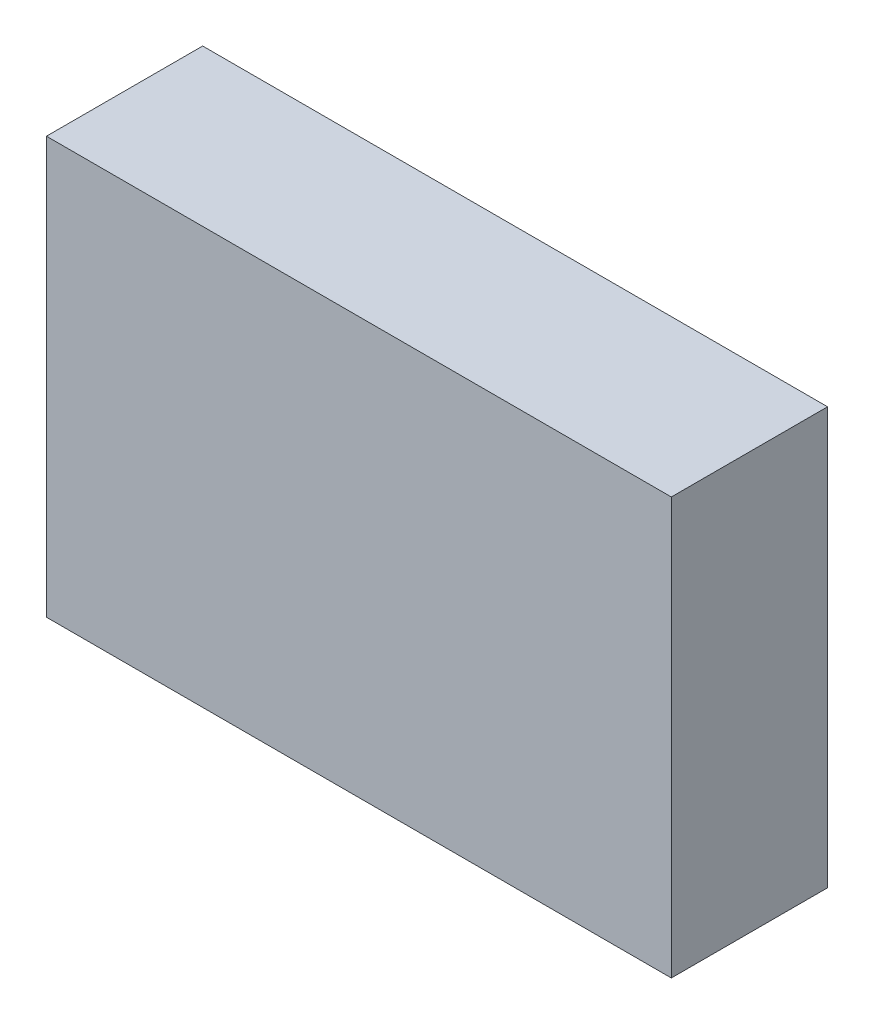
ISO-10303-21;
HEADER;
FILE_DESCRIPTION(('STEP AP214'),'2;1');
FILE_NAME('part.step','',(''),(''),'','','');
FILE_SCHEMA(('AUTOMOTIVE_DESIGN { 1 0 10303 214 1 1 1 1 }'));
ENDSEC;
DATA;
#1=APPLICATION_CONTEXT('core data for automotive mechanical design processes');
#2=APPLICATION_PROTOCOL_DEFINITION('international standard','automotive_design',2000,#1);
#3=PRODUCT_CONTEXT('',#1,'mechanical');
#4=PRODUCT('Part','Part','',(#3));
#5=PRODUCT_RELATED_PRODUCT_CATEGORY('part','',(#4));
#6=PRODUCT_DEFINITION_FORMATION('','',#4);
#7=PRODUCT_DEFINITION_CONTEXT('part definition',#1,'design');
#8=PRODUCT_DEFINITION('design','',#6,#7);
#9=PRODUCT_DEFINITION_SHAPE('','',#8);
#10=(LENGTH_UNIT() NAMED_UNIT(*) SI_UNIT(.MILLI.,.METRE.));
#11=(NAMED_UNIT(*) PLANE_ANGLE_UNIT() SI_UNIT($,.RADIAN.));
#12=(NAMED_UNIT(*) SI_UNIT($,.STERADIAN.) SOLID_ANGLE_UNIT());
#13=UNCERTAINTY_MEASURE_WITH_UNIT(LENGTH_MEASURE(1.E-05),#10,'distance_accuracy_value','');
#14=(GEOMETRIC_REPRESENTATION_CONTEXT(3) GLOBAL_UNCERTAINTY_ASSIGNED_CONTEXT((#13)) GLOBAL_UNIT_ASSIGNED_CONTEXT((#10,
#11,#12)) REPRESENTATION_CONTEXT('',''));
#15=CARTESIAN_POINT('',(0.,0.,0.));
#16=DIRECTION('',(0.,0.,1.));
#17=DIRECTION('',(1.,0.,0.));
#18=AXIS2_PLACEMENT_3D('',#15,#16,#17);
#19=CARTESIAN_POINT('',(30.,-20.,15.));
#20=DIRECTION('',(-1.,0.,0.));
#21=DIRECTION('',(0.,0.,1.));
#22=AXIS2_PLACEMENT_3D('',#19,#20,#21);
#23=PLANE('',#22);
#24=DIRECTION('',(0.,1.,0.));
#25=VECTOR('',#24,1.);
#26=CARTESIAN_POINT('',(30.,-20.,0.));
#27=LINE('',#26,#25);
#28=CARTESIAN_POINT('',(30.,-20.,0.));
#29=VERTEX_POINT('',#28);
#30=CARTESIAN_POINT('',(30.,20.,0.));
#31=VERTEX_POINT('',#30);
#32=EDGE_CURVE('E107',#29,#31,#27,.T.);
#33=ORIENTED_EDGE('',*,*,#32,.T.);
#34=DIRECTION('',(0.,0.,-1.));
#35=VECTOR('',#34,1.);
#36=CARTESIAN_POINT('',(30.,20.,15.));
#37=LINE('',#36,#35);
#38=CARTESIAN_POINT('',(30.,20.,15.));
#39=VERTEX_POINT('',#38);
#40=EDGE_CURVE('E11',#39,#31,#37,.T.);
#41=ORIENTED_EDGE('',*,*,#40,.F.);
#42=DIRECTION('',(0.,1.,0.));
#43=VECTOR('',#42,1.);
#44=CARTESIAN_POINT('',(30.,-20.,15.));
#45=LINE('',#44,#43);
#46=CARTESIAN_POINT('',(30.,-20.,15.));
#47=VERTEX_POINT('',#46);
#48=EDGE_CURVE('E91',#47,#39,#45,.T.);
#49=ORIENTED_EDGE('',*,*,#48,.F.);
#50=DIRECTION('',(0.,0.,-1.));
#51=VECTOR('',#50,1.);
#52=CARTESIAN_POINT('',(30.,-20.,15.));
#53=LINE('',#52,#51);
#54=EDGE_CURVE('E103',#47,#29,#53,.T.);
#55=ORIENTED_EDGE('',*,*,#54,.T.);
#56=EDGE_LOOP('',(#33,#41,#49,#55));
#57=FACE_BOUND('',#56,.T.);
#58=ADVANCED_FACE('F39',(#57),#23,.F.);
#59=CARTESIAN_POINT('',(-30.,20.,15.));
#60=DIRECTION('',(0.,-1.,0.));
#61=DIRECTION('',(0.,0.,-1.));
#62=AXIS2_PLACEMENT_3D('',#59,#60,#61);
#63=PLANE('',#62);
#64=DIRECTION('',(-1.,0.,0.));
#65=VECTOR('',#64,1.);
#66=CARTESIAN_POINT('',(-30.,20.,0.));
#67=LINE('',#66,#65);
#68=CARTESIAN_POINT('',(-30.,20.,0.));
#69=VERTEX_POINT('',#68);
#70=EDGE_CURVE('E96',#31,#69,#67,.T.);
#71=ORIENTED_EDGE('',*,*,#70,.T.);
#72=DIRECTION('',(0.,0.,-1.));
#73=VECTOR('',#72,1.);
#74=CARTESIAN_POINT('',(-30.,20.,15.));
#75=LINE('',#74,#73);
#76=CARTESIAN_POINT('',(-30.,20.,15.));
#77=VERTEX_POINT('',#76);
#78=EDGE_CURVE('E48',#77,#69,#75,.T.);
#79=ORIENTED_EDGE('',*,*,#78,.F.);
#80=DIRECTION('',(-1.,0.,0.));
#81=VECTOR('',#80,1.);
#82=CARTESIAN_POINT('',(-30.,20.,15.));
#83=LINE('',#82,#81);
#84=EDGE_CURVE('E86',#39,#77,#83,.T.);
#85=ORIENTED_EDGE('',*,*,#84,.F.);
#86=ORIENTED_EDGE('',*,*,#40,.T.);
#87=EDGE_LOOP('',(#71,#79,#85,#86));
#88=FACE_BOUND('',#87,.T.);
#89=ADVANCED_FACE('F95',(#88),#63,.F.);
#90=CARTESIAN_POINT('',(-30.,-20.,15.));
#91=DIRECTION('',(1.,0.,0.));
#92=DIRECTION('',(0.,0.,-1.));
#93=AXIS2_PLACEMENT_3D('',#90,#91,#92);
#94=PLANE('',#93);
#95=DIRECTION('',(0.,-1.,0.));
#96=VECTOR('',#95,1.);
#97=CARTESIAN_POINT('',(-30.,-20.,0.));
#98=LINE('',#97,#96);
#99=CARTESIAN_POINT('',(-30.,-20.,0.));
#100=VERTEX_POINT('',#99);
#101=EDGE_CURVE('E73',#69,#100,#98,.T.);
#102=ORIENTED_EDGE('',*,*,#101,.T.);
#103=DIRECTION('',(0.,0.,-1.));
#104=VECTOR('',#103,1.);
#105=CARTESIAN_POINT('',(-30.,-20.,15.));
#106=LINE('',#105,#104);
#107=CARTESIAN_POINT('',(-30.,-20.,15.));
#108=VERTEX_POINT('',#107);
#109=EDGE_CURVE('E98',#108,#100,#106,.T.);
#110=ORIENTED_EDGE('',*,*,#109,.F.);
#111=DIRECTION('',(0.,-1.,0.));
#112=VECTOR('',#111,1.);
#113=CARTESIAN_POINT('',(-30.,-20.,15.));
#114=LINE('',#113,#112);
#115=EDGE_CURVE('E89',#77,#108,#114,.T.);
#116=ORIENTED_EDGE('',*,*,#115,.F.);
#117=ORIENTED_EDGE('',*,*,#78,.T.);
#118=EDGE_LOOP('',(#102,#110,#116,#117));
#119=FACE_BOUND('',#118,.T.);
#120=ADVANCED_FACE('F99',(#119),#94,.F.);
#121=CARTESIAN_POINT('',(-30.,-20.,15.));
#122=DIRECTION('',(0.,1.,0.));
#123=DIRECTION('',(0.,0.,1.));
#124=AXIS2_PLACEMENT_3D('',#121,#122,#123);
#125=PLANE('',#124);
#126=DIRECTION('',(1.,0.,0.));
#127=VECTOR('',#126,1.);
#128=CARTESIAN_POINT('',(-30.,-20.,0.));
#129=LINE('',#128,#127);
#130=EDGE_CURVE('E79',#100,#29,#129,.T.);
#131=ORIENTED_EDGE('',*,*,#130,.T.);
#132=ORIENTED_EDGE('',*,*,#54,.F.);
#133=DIRECTION('',(1.,0.,0.));
#134=VECTOR('',#133,1.);
#135=CARTESIAN_POINT('',(-30.,-20.,15.));
#136=LINE('',#135,#134);
#137=EDGE_CURVE('E56',#108,#47,#136,.T.);
#138=ORIENTED_EDGE('',*,*,#137,.F.);
#139=ORIENTED_EDGE('',*,*,#109,.T.);
#140=EDGE_LOOP('',(#131,#132,#138,#139));
#141=FACE_BOUND('',#140,.T.);
#142=ADVANCED_FACE('F120',(#141),#125,.F.);
#143=CARTESIAN_POINT('',(0.,0.,15.));
#144=DIRECTION('',(0.,0.,-1.));
#145=DIRECTION('',(-1.,0.,0.));
#146=AXIS2_PLACEMENT_3D('',#143,#144,#145);
#147=PLANE('',#146);
#148=ORIENTED_EDGE('',*,*,#48,.T.);
#149=ORIENTED_EDGE('',*,*,#84,.T.);
#150=ORIENTED_EDGE('',*,*,#115,.T.);
#151=ORIENTED_EDGE('',*,*,#137,.T.);
#152=EDGE_LOOP('',(#148,#149,#150,#151));
#153=FACE_BOUND('',#152,.T.);
#154=ADVANCED_FACE('F87',(#153),#147,.F.);
#155=CARTESIAN_POINT('',(0.,0.,0.));
#156=DIRECTION('',(0.,0.,-1.));
#157=DIRECTION('',(-1.,0.,0.));
#158=AXIS2_PLACEMENT_3D('',#155,#156,#157);
#159=PLANE('',#158);
#160=ORIENTED_EDGE('',*,*,#32,.F.);
#161=ORIENTED_EDGE('',*,*,#130,.F.);
#162=ORIENTED_EDGE('',*,*,#101,.F.);
#163=ORIENTED_EDGE('',*,*,#70,.F.);
#164=EDGE_LOOP('',(#160,#161,#162,#163));
#165=FACE_BOUND('',#164,.T.);
#166=ADVANCED_FACE('F123',(#165),#159,.T.);
#167=CLOSED_SHELL('',(#58,#89,#120,#142,#154,#166));
#168=MANIFOLD_SOLID_BREP('B2',#167);
#169=ADVANCED_BREP_SHAPE_REPRESENTATION('',(#18,#168),#14);
#170=SHAPE_DEFINITION_REPRESENTATION(#9,#169);
ENDSEC;
END-ISO-10303-21;
